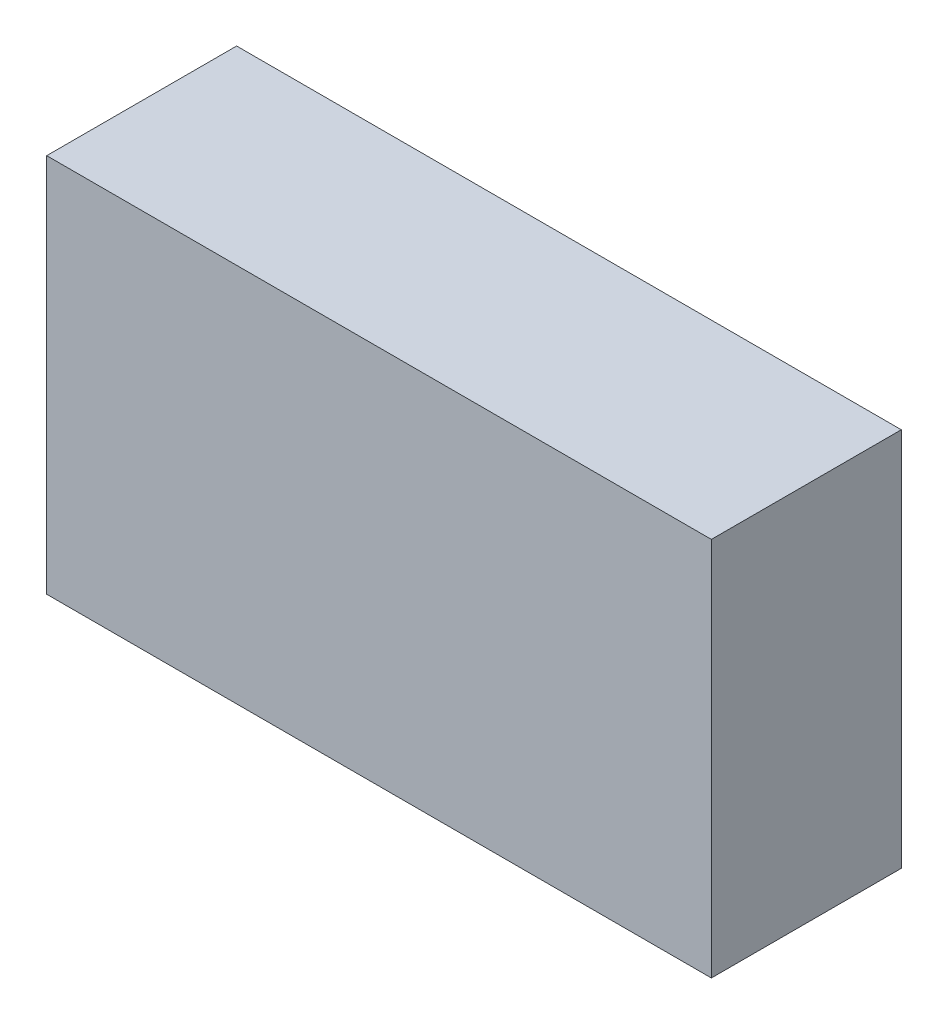
ISO-10303-21;
HEADER;
FILE_DESCRIPTION(('STEP AP214'),'2;1');
FILE_NAME('part.step','',(''),(''),'','','');
FILE_SCHEMA(('AUTOMOTIVE_DESIGN { 1 0 10303 214 1 1 1 1 }'));
ENDSEC;
DATA;
#1=APPLICATION_CONTEXT('core data for automotive mechanical design processes');
#2=APPLICATION_PROTOCOL_DEFINITION('international standard','automotive_design',2000,#1);
#3=PRODUCT_CONTEXT('',#1,'mechanical');
#4=PRODUCT('Part','Part','',(#3));
#5=PRODUCT_RELATED_PRODUCT_CATEGORY('part','',(#4));
#6=PRODUCT_DEFINITION_FORMATION('','',#4);
#7=PRODUCT_DEFINITION_CONTEXT('part definition',#1,'design');
#8=PRODUCT_DEFINITION('design','',#6,#7);
#9=PRODUCT_DEFINITION_SHAPE('','',#8);
#10=(LENGTH_UNIT() NAMED_UNIT(*) SI_UNIT(.MILLI.,.METRE.));
#11=(NAMED_UNIT(*) PLANE_ANGLE_UNIT() SI_UNIT($,.RADIAN.));
#12=(NAMED_UNIT(*) SI_UNIT($,.STERADIAN.) SOLID_ANGLE_UNIT());
#13=UNCERTAINTY_MEASURE_WITH_UNIT(LENGTH_MEASURE(1.E-05),#10,'distance_accuracy_value','');
#14=(GEOMETRIC_REPRESENTATION_CONTEXT(3) GLOBAL_UNCERTAINTY_ASSIGNED_CONTEXT((#13)) GLOBAL_UNIT_ASSIGNED_CONTEXT((#10,
#11,#12)) REPRESENTATION_CONTEXT('',''));
#15=CARTESIAN_POINT('',(0.,0.,0.));
#16=DIRECTION('',(0.,0.,1.));
#17=DIRECTION('',(1.,0.,0.));
#18=AXIS2_PLACEMENT_3D('',#15,#16,#17);
#19=CARTESIAN_POINT('',(24.5999,54.150006,1.12268));
#20=DIRECTION('',(0.,1.,0.));
#21=DIRECTION('',(1.,0.,0.));
#22=AXIS2_PLACEMENT_3D('',#19,#20,#21);
#23=PLANE('',#22);
#24=DIRECTION('',(0.,0.,1.));
#25=VECTOR('',#24,1.);
#26=CARTESIAN_POINT('',(27.399996,54.150006,0.32258));
#27=LINE('',#26,#25);
#28=CARTESIAN_POINT('',(27.399996,54.150006,0.32258));
#29=VERTEX_POINT('',#28);
#30=CARTESIAN_POINT('',(27.399996,54.150006,1.12268));
#31=VERTEX_POINT('',#30);
#32=EDGE_CURVE('E11',#29,#31,#27,.T.);
#33=ORIENTED_EDGE('',*,*,#32,.T.);
#34=DIRECTION('',(-1.,0.,0.));
#35=VECTOR('',#34,1.);
#36=CARTESIAN_POINT('',(27.399996,54.150006,1.12268));
#37=LINE('',#36,#35);
#38=CARTESIAN_POINT('',(24.5999,54.150006,1.12268));
#39=VERTEX_POINT('',#38);
#40=EDGE_CURVE('E73',#31,#39,#37,.T.);
#41=ORIENTED_EDGE('',*,*,#40,.T.);
#42=DIRECTION('',(0.,0.,1.));
#43=VECTOR('',#42,1.);
#44=CARTESIAN_POINT('',(24.5999,54.150006,0.32258));
#45=LINE('',#44,#43);
#46=CARTESIAN_POINT('',(24.5999,54.150006,0.32258));
#47=VERTEX_POINT('',#46);
#48=EDGE_CURVE('E67',#47,#39,#45,.T.);
#49=ORIENTED_EDGE('',*,*,#48,.F.);
#50=DIRECTION('',(1.,0.,0.));
#51=VECTOR('',#50,1.);
#52=CARTESIAN_POINT('',(24.5999,54.150006,0.32258));
#53=LINE('',#52,#51);
#54=EDGE_CURVE('E70',#47,#29,#53,.T.);
#55=ORIENTED_EDGE('',*,*,#54,.T.);
#56=EDGE_LOOP('',(#33,#41,#49,#55));
#57=FACE_BOUND('',#56,.T.);
#58=ADVANCED_FACE('F18',(#57),#23,.F.);
#59=CARTESIAN_POINT('',(27.399996,54.150006,1.12268));
#60=DIRECTION('',(-1.,0.,0.));
#61=DIRECTION('',(0.,0.,1.));
#62=AXIS2_PLACEMENT_3D('',#59,#60,#61);
#63=PLANE('',#62);
#64=DIRECTION('',(0.,0.,-1.));
#65=VECTOR('',#64,1.);
#66=CARTESIAN_POINT('',(27.399996,55.750206,1.12268));
#67=LINE('',#66,#65);
#68=CARTESIAN_POINT('',(27.399996,55.750206,1.12268));
#69=VERTEX_POINT('',#68);
#70=CARTESIAN_POINT('',(27.399996,55.750206,0.32258));
#71=VERTEX_POINT('',#70);
#72=EDGE_CURVE('E110',#69,#71,#67,.T.);
#73=ORIENTED_EDGE('',*,*,#72,.F.);
#74=DIRECTION('',(0.,-1.,0.));
#75=VECTOR('',#74,1.);
#76=CARTESIAN_POINT('',(27.399996,55.750206,1.12268));
#77=LINE('',#76,#75);
#78=EDGE_CURVE('E21',#69,#31,#77,.T.);
#79=ORIENTED_EDGE('',*,*,#78,.T.);
#80=ORIENTED_EDGE('',*,*,#32,.F.);
#81=DIRECTION('',(0.,1.,0.));
#82=VECTOR('',#81,1.);
#83=CARTESIAN_POINT('',(27.399996,54.150006,0.32258));
#84=LINE('',#83,#82);
#85=EDGE_CURVE('E90',#29,#71,#84,.T.);
#86=ORIENTED_EDGE('',*,*,#85,.T.);
#87=EDGE_LOOP('',(#73,#79,#80,#86));
#88=FACE_BOUND('',#87,.T.);
#89=ADVANCED_FACE('F108',(#88),#63,.F.);
#90=CARTESIAN_POINT('',(0.,0.,1.12268));
#91=DIRECTION('',(0.,0.,1.));
#92=DIRECTION('',(1.,0.,0.));
#93=AXIS2_PLACEMENT_3D('',#90,#91,#92);
#94=PLANE('',#93);
#95=DIRECTION('',(0.,1.,0.));
#96=VECTOR('',#95,1.);
#97=CARTESIAN_POINT('',(24.5999,54.150006,1.12268));
#98=LINE('',#97,#96);
#99=CARTESIAN_POINT('',(24.5999,55.750206,1.12268));
#100=VERTEX_POINT('',#99);
#101=EDGE_CURVE('E77',#39,#100,#98,.T.);
#102=ORIENTED_EDGE('',*,*,#101,.F.);
#103=ORIENTED_EDGE('',*,*,#40,.F.);
#104=ORIENTED_EDGE('',*,*,#78,.F.);
#105=DIRECTION('',(1.,0.,0.));
#106=VECTOR('',#105,1.);
#107=CARTESIAN_POINT('',(24.5999,55.750206,1.12268));
#108=LINE('',#107,#106);
#109=EDGE_CURVE('E115',#100,#69,#108,.T.);
#110=ORIENTED_EDGE('',*,*,#109,.F.);
#111=EDGE_LOOP('',(#102,#103,#104,#110));
#112=FACE_BOUND('',#111,.T.);
#113=ADVANCED_FACE('F114',(#112),#94,.T.);
#114=CARTESIAN_POINT('',(24.5999,55.750206,1.12268));
#115=DIRECTION('',(1.,0.,0.));
#116=DIRECTION('',(0.,1.,0.));
#117=AXIS2_PLACEMENT_3D('',#114,#115,#116);
#118=PLANE('',#117);
#119=ORIENTED_EDGE('',*,*,#48,.T.);
#120=ORIENTED_EDGE('',*,*,#101,.T.);
#121=DIRECTION('',(0.,0.,1.));
#122=VECTOR('',#121,1.);
#123=CARTESIAN_POINT('',(24.5999,55.750206,0.32258));
#124=LINE('',#123,#122);
#125=CARTESIAN_POINT('',(24.5999,55.750206,0.32258));
#126=VERTEX_POINT('',#125);
#127=EDGE_CURVE('E83',#126,#100,#124,.T.);
#128=ORIENTED_EDGE('',*,*,#127,.F.);
#129=DIRECTION('',(0.,-1.,0.));
#130=VECTOR('',#129,1.);
#131=CARTESIAN_POINT('',(24.5999,55.750206,0.32258));
#132=LINE('',#131,#130);
#133=EDGE_CURVE('E78',#126,#47,#132,.T.);
#134=ORIENTED_EDGE('',*,*,#133,.T.);
#135=EDGE_LOOP('',(#119,#120,#128,#134));
#136=FACE_BOUND('',#135,.T.);
#137=ADVANCED_FACE('F81',(#136),#118,.F.);
#138=CARTESIAN_POINT('',(0.,0.,0.32258));
#139=DIRECTION('',(0.,0.,1.));
#140=DIRECTION('',(1.,0.,0.));
#141=AXIS2_PLACEMENT_3D('',#138,#139,#140);
#142=PLANE('',#141);
#143=ORIENTED_EDGE('',*,*,#85,.F.);
#144=ORIENTED_EDGE('',*,*,#54,.F.);
#145=ORIENTED_EDGE('',*,*,#133,.F.);
#146=DIRECTION('',(-1.,0.,0.));
#147=VECTOR('',#146,1.);
#148=CARTESIAN_POINT('',(27.399996,55.750206,0.32258));
#149=LINE('',#148,#147);
#150=EDGE_CURVE('E96',#71,#126,#149,.T.);
#151=ORIENTED_EDGE('',*,*,#150,.F.);
#152=EDGE_LOOP('',(#143,#144,#145,#151));
#153=FACE_BOUND('',#152,.T.);
#154=ADVANCED_FACE('F89',(#153),#142,.F.);
#155=CARTESIAN_POINT('',(27.399996,55.750206,1.12268));
#156=DIRECTION('',(0.,-1.,0.));
#157=DIRECTION('',(0.,0.,-1.));
#158=AXIS2_PLACEMENT_3D('',#155,#156,#157);
#159=PLANE('',#158);
#160=ORIENTED_EDGE('',*,*,#127,.T.);
#161=ORIENTED_EDGE('',*,*,#109,.T.);
#162=ORIENTED_EDGE('',*,*,#72,.T.);
#163=ORIENTED_EDGE('',*,*,#150,.T.);
#164=EDGE_LOOP('',(#160,#161,#162,#163));
#165=FACE_BOUND('',#164,.T.);
#166=ADVANCED_FACE('F119',(#165),#159,.F.);
#167=CLOSED_SHELL('',(#58,#89,#113,#137,#154,#166));
#168=MANIFOLD_SOLID_BREP('B1',#167);
#169=ADVANCED_BREP_SHAPE_REPRESENTATION('',(#18,#168),#14);
#170=SHAPE_DEFINITION_REPRESENTATION(#9,#169);
ENDSEC;
END-ISO-10303-21;
